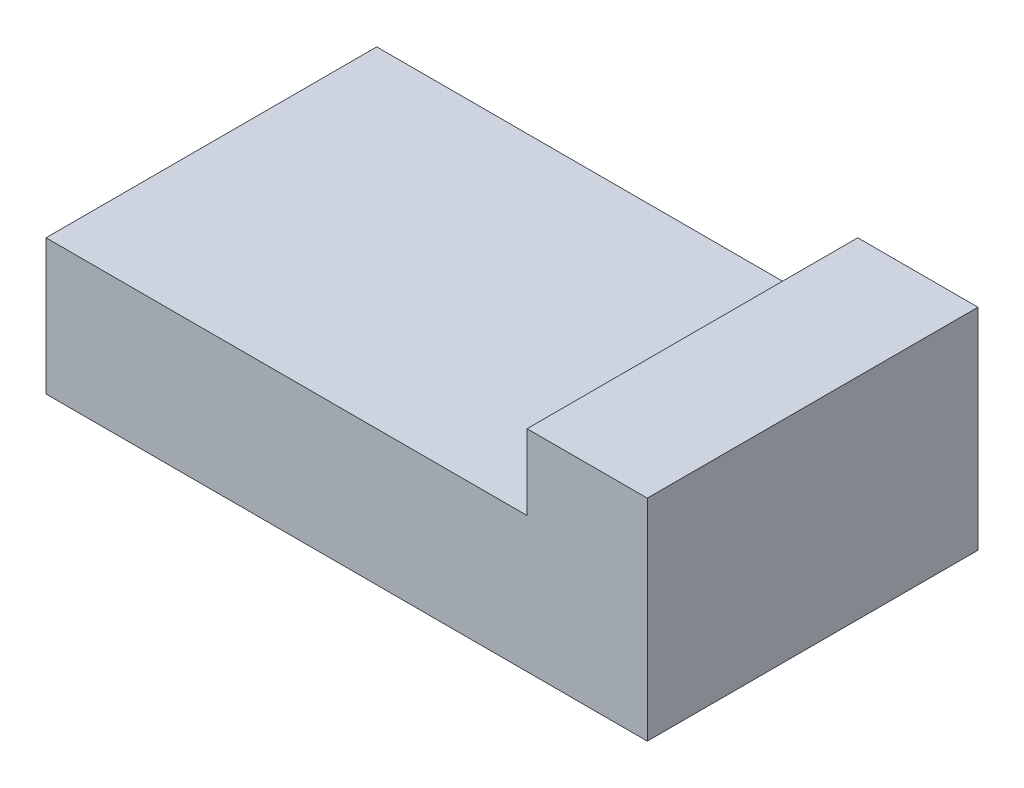
ISO-10303-21;
HEADER;
FILE_DESCRIPTION(('STEP AP214'),'2;1');
FILE_NAME('part.step','',(''),(''),'','','');
FILE_SCHEMA(('AUTOMOTIVE_DESIGN { 1 0 10303 214 1 1 1 1 }'));
ENDSEC;
DATA;
#1=APPLICATION_CONTEXT('core data for automotive mechanical design processes');
#2=APPLICATION_PROTOCOL_DEFINITION('international standard','automotive_design',2000,#1);
#3=PRODUCT_CONTEXT('',#1,'mechanical');
#4=PRODUCT('Part','Part','',(#3));
#5=PRODUCT_RELATED_PRODUCT_CATEGORY('part','',(#4));
#6=PRODUCT_DEFINITION_FORMATION('','',#4);
#7=PRODUCT_DEFINITION_CONTEXT('part definition',#1,'design');
#8=PRODUCT_DEFINITION('design','',#6,#7);
#9=PRODUCT_DEFINITION_SHAPE('','',#8);
#10=(LENGTH_UNIT() NAMED_UNIT(*) SI_UNIT(.MILLI.,.METRE.));
#11=(NAMED_UNIT(*) PLANE_ANGLE_UNIT() SI_UNIT($,.RADIAN.));
#12=(NAMED_UNIT(*) SI_UNIT($,.STERADIAN.) SOLID_ANGLE_UNIT());
#13=UNCERTAINTY_MEASURE_WITH_UNIT(LENGTH_MEASURE(1.E-05),#10,'distance_accuracy_value','');
#14=(GEOMETRIC_REPRESENTATION_CONTEXT(3) GLOBAL_UNCERTAINTY_ASSIGNED_CONTEXT((#13)) GLOBAL_UNIT_ASSIGNED_CONTEXT((#10,
#11,#12)) REPRESENTATION_CONTEXT('',''));
#15=CARTESIAN_POINT('',(0.,0.,0.));
#16=DIRECTION('',(0.,0.,1.));
#17=DIRECTION('',(1.,0.,0.));
#18=AXIS2_PLACEMENT_3D('',#15,#16,#17);
#19=CARTESIAN_POINT('',(20.,9.,-11.));
#20=DIRECTION('',(-1.,0.,0.));
#21=DIRECTION('',(0.,0.,1.));
#22=AXIS2_PLACEMENT_3D('',#19,#20,#21);
#23=PLANE('',#22);
#24=DIRECTION('',(0.,0.,-1.));
#25=VECTOR('',#24,1.);
#26=CARTESIAN_POINT('',(20.,0.,-11.));
#27=LINE('',#26,#25);
#28=CARTESIAN_POINT('',(20.,0.,11.));
#29=VERTEX_POINT('',#28);
#30=CARTESIAN_POINT('',(20.,0.,-11.));
#31=VERTEX_POINT('',#30);
#32=EDGE_CURVE('E99',#29,#31,#27,.T.);
#33=ORIENTED_EDGE('',*,*,#32,.T.);
#34=DIRECTION('',(0.,-1.,0.));
#35=VECTOR('',#34,1.);
#36=CARTESIAN_POINT('',(20.,9.,-11.));
#37=LINE('',#36,#35);
#38=CARTESIAN_POINT('',(20.,14.,-11.));
#39=VERTEX_POINT('',#38);
#40=EDGE_CURVE('E11',#39,#31,#37,.T.);
#41=ORIENTED_EDGE('',*,*,#40,.F.);
#42=DIRECTION('',(0.,0.,-1.));
#43=VECTOR('',#42,1.);
#44=CARTESIAN_POINT('',(20.,14.,-11.));
#45=LINE('',#44,#43);
#46=CARTESIAN_POINT('',(20.,14.,11.));
#47=VERTEX_POINT('',#46);
#48=EDGE_CURVE('E101',#47,#39,#45,.T.);
#49=ORIENTED_EDGE('',*,*,#48,.F.);
#50=DIRECTION('',(0.,-1.,0.));
#51=VECTOR('',#50,1.);
#52=CARTESIAN_POINT('',(20.,9.,11.));
#53=LINE('',#52,#51);
#54=EDGE_CURVE('E84',#47,#29,#53,.T.);
#55=ORIENTED_EDGE('',*,*,#54,.T.);
#56=EDGE_LOOP('',(#33,#41,#49,#55));
#57=FACE_BOUND('',#56,.T.);
#58=ADVANCED_FACE('F39',(#57),#23,.F.);
#59=CARTESIAN_POINT('',(-20.,9.,-11.));
#60=DIRECTION('',(0.,0.,1.));
#61=DIRECTION('',(1.,0.,0.));
#62=AXIS2_PLACEMENT_3D('',#59,#60,#61);
#63=PLANE('',#62);
#64=DIRECTION('',(-1.,0.,0.));
#65=VECTOR('',#64,1.);
#66=CARTESIAN_POINT('',(-20.,0.,-11.));
#67=LINE('',#66,#65);
#68=CARTESIAN_POINT('',(-20.,0.,-11.));
#69=VERTEX_POINT('',#68);
#70=EDGE_CURVE('E106',#31,#69,#67,.T.);
#71=ORIENTED_EDGE('',*,*,#70,.T.);
#72=DIRECTION('',(0.,-1.,0.));
#73=VECTOR('',#72,1.);
#74=CARTESIAN_POINT('',(-20.,9.,-11.));
#75=LINE('',#74,#73);
#76=CARTESIAN_POINT('',(-20.,9.,-11.));
#77=VERTEX_POINT('',#76);
#78=EDGE_CURVE('E47',#77,#69,#75,.T.);
#79=ORIENTED_EDGE('',*,*,#78,.F.);
#80=DIRECTION('',(-1.,0.,0.));
#81=VECTOR('',#80,1.);
#82=CARTESIAN_POINT('',(-20.,9.,-11.));
#83=LINE('',#82,#81);
#84=CARTESIAN_POINT('',(12.,9.,-11.));
#85=VERTEX_POINT('',#84);
#86=EDGE_CURVE('E92',#85,#77,#83,.T.);
#87=ORIENTED_EDGE('',*,*,#86,.F.);
#88=DIRECTION('',(0.,-1.,0.));
#89=VECTOR('',#88,1.);
#90=CARTESIAN_POINT('',(12.,14.,-11.));
#91=LINE('',#90,#89);
#92=CARTESIAN_POINT('',(12.,14.,-11.));
#93=VERTEX_POINT('',#92);
#94=EDGE_CURVE('E108',#93,#85,#91,.T.);
#95=ORIENTED_EDGE('',*,*,#94,.F.);
#96=DIRECTION('',(-1.,0.,0.));
#97=VECTOR('',#96,1.);
#98=CARTESIAN_POINT('',(20.,14.,-11.));
#99=LINE('',#98,#97);
#100=EDGE_CURVE('E133',#39,#93,#99,.T.);
#101=ORIENTED_EDGE('',*,*,#100,.F.);
#102=ORIENTED_EDGE('',*,*,#40,.T.);
#103=EDGE_LOOP('',(#71,#79,#87,#95,#101,#102));
#104=FACE_BOUND('',#103,.T.);
#105=ADVANCED_FACE('F128',(#104),#63,.F.);
#106=CARTESIAN_POINT('',(-20.,9.,-11.));
#107=DIRECTION('',(1.,0.,0.));
#108=DIRECTION('',(0.,0.,-1.));
#109=AXIS2_PLACEMENT_3D('',#106,#107,#108);
#110=PLANE('',#109);
#111=DIRECTION('',(0.,0.,1.));
#112=VECTOR('',#111,1.);
#113=CARTESIAN_POINT('',(-20.,0.,-11.));
#114=LINE('',#113,#112);
#115=CARTESIAN_POINT('',(-20.,0.,11.));
#116=VERTEX_POINT('',#115);
#117=EDGE_CURVE('E93',#69,#116,#114,.T.);
#118=ORIENTED_EDGE('',*,*,#117,.T.);
#119=DIRECTION('',(0.,-1.,0.));
#120=VECTOR('',#119,1.);
#121=CARTESIAN_POINT('',(-20.,9.,11.));
#122=LINE('',#121,#120);
#123=CARTESIAN_POINT('',(-20.,9.,11.));
#124=VERTEX_POINT('',#123);
#125=EDGE_CURVE('E87',#124,#116,#122,.T.);
#126=ORIENTED_EDGE('',*,*,#125,.F.);
#127=DIRECTION('',(0.,0.,1.));
#128=VECTOR('',#127,1.);
#129=CARTESIAN_POINT('',(-20.,9.,-11.));
#130=LINE('',#129,#128);
#131=EDGE_CURVE('E60',#77,#124,#130,.T.);
#132=ORIENTED_EDGE('',*,*,#131,.F.);
#133=ORIENTED_EDGE('',*,*,#78,.T.);
#134=EDGE_LOOP('',(#118,#126,#132,#133));
#135=FACE_BOUND('',#134,.T.);
#136=ADVANCED_FACE('F126',(#135),#110,.F.);
#137=CARTESIAN_POINT('',(-20.,9.,11.));
#138=DIRECTION('',(0.,0.,-1.));
#139=DIRECTION('',(-1.,0.,0.));
#140=AXIS2_PLACEMENT_3D('',#137,#138,#139);
#141=PLANE('',#140);
#142=DIRECTION('',(1.,0.,0.));
#143=VECTOR('',#142,1.);
#144=CARTESIAN_POINT('',(-20.,0.,11.));
#145=LINE('',#144,#143);
#146=EDGE_CURVE('E80',#116,#29,#145,.T.);
#147=ORIENTED_EDGE('',*,*,#146,.T.);
#148=ORIENTED_EDGE('',*,*,#54,.F.);
#149=DIRECTION('',(1.,0.,0.));
#150=VECTOR('',#149,1.);
#151=CARTESIAN_POINT('',(20.,14.,11.));
#152=LINE('',#151,#150);
#153=CARTESIAN_POINT('',(12.,14.,11.));
#154=VERTEX_POINT('',#153);
#155=EDGE_CURVE('E147',#154,#47,#152,.T.);
#156=ORIENTED_EDGE('',*,*,#155,.F.);
#157=DIRECTION('',(0.,-1.,0.));
#158=VECTOR('',#157,1.);
#159=CARTESIAN_POINT('',(12.,14.,11.));
#160=LINE('',#159,#158);
#161=CARTESIAN_POINT('',(12.,9.,11.));
#162=VERTEX_POINT('',#161);
#163=EDGE_CURVE('E114',#154,#162,#160,.T.);
#164=ORIENTED_EDGE('',*,*,#163,.T.);
#165=DIRECTION('',(1.,0.,0.));
#166=VECTOR('',#165,1.);
#167=CARTESIAN_POINT('',(-20.,9.,11.));
#168=LINE('',#167,#166);
#169=EDGE_CURVE('E103',#124,#162,#168,.T.);
#170=ORIENTED_EDGE('',*,*,#169,.F.);
#171=ORIENTED_EDGE('',*,*,#125,.T.);
#172=EDGE_LOOP('',(#147,#148,#156,#164,#170,#171));
#173=FACE_BOUND('',#172,.T.);
#174=ADVANCED_FACE('F82',(#173),#141,.F.);
#175=CARTESIAN_POINT('',(0.,9.,0.));
#176=DIRECTION('',(0.,1.,0.));
#177=DIRECTION('',(0.,0.,1.));
#178=AXIS2_PLACEMENT_3D('',#175,#176,#177);
#179=PLANE('',#178);
#180=DIRECTION('',(0.,0.,1.));
#181=VECTOR('',#180,1.);
#182=CARTESIAN_POINT('',(12.,9.,-11.));
#183=LINE('',#182,#181);
#184=EDGE_CURVE('E54',#85,#162,#183,.T.);
#185=ORIENTED_EDGE('',*,*,#184,.F.);
#186=ORIENTED_EDGE('',*,*,#86,.T.);
#187=ORIENTED_EDGE('',*,*,#131,.T.);
#188=ORIENTED_EDGE('',*,*,#169,.T.);
#189=EDGE_LOOP('',(#185,#186,#187,#188));
#190=FACE_BOUND('',#189,.T.);
#191=ADVANCED_FACE('F164',(#190),#179,.T.);
#192=CARTESIAN_POINT('',(0.,0.,0.));
#193=DIRECTION('',(0.,1.,0.));
#194=DIRECTION('',(0.,0.,1.));
#195=AXIS2_PLACEMENT_3D('',#192,#193,#194);
#196=PLANE('',#195);
#197=ORIENTED_EDGE('',*,*,#32,.F.);
#198=ORIENTED_EDGE('',*,*,#146,.F.);
#199=ORIENTED_EDGE('',*,*,#117,.F.);
#200=ORIENTED_EDGE('',*,*,#70,.F.);
#201=EDGE_LOOP('',(#197,#198,#199,#200));
#202=FACE_BOUND('',#201,.T.);
#203=ADVANCED_FACE('F105',(#202),#196,.F.);
#204=CARTESIAN_POINT('',(12.,14.,-11.));
#205=DIRECTION('',(1.,0.,0.));
#206=DIRECTION('',(0.,0.,-1.));
#207=AXIS2_PLACEMENT_3D('',#204,#205,#206);
#208=PLANE('',#207);
#209=ORIENTED_EDGE('',*,*,#184,.T.);
#210=ORIENTED_EDGE('',*,*,#163,.F.);
#211=DIRECTION('',(0.,0.,1.));
#212=VECTOR('',#211,1.);
#213=CARTESIAN_POINT('',(12.,14.,-11.));
#214=LINE('',#213,#212);
#215=EDGE_CURVE('E144',#93,#154,#214,.T.);
#216=ORIENTED_EDGE('',*,*,#215,.F.);
#217=ORIENTED_EDGE('',*,*,#94,.T.);
#218=EDGE_LOOP('',(#209,#210,#216,#217));
#219=FACE_BOUND('',#218,.T.);
#220=ADVANCED_FACE('F152',(#219),#208,.F.);
#221=CARTESIAN_POINT('',(0.,14.,0.));
#222=DIRECTION('',(0.,-1.,0.));
#223=DIRECTION('',(0.,0.,-1.));
#224=AXIS2_PLACEMENT_3D('',#221,#222,#223);
#225=PLANE('',#224);
#226=ORIENTED_EDGE('',*,*,#48,.T.);
#227=ORIENTED_EDGE('',*,*,#100,.T.);
#228=ORIENTED_EDGE('',*,*,#215,.T.);
#229=ORIENTED_EDGE('',*,*,#155,.T.);
#230=EDGE_LOOP('',(#226,#227,#228,#229));
#231=FACE_BOUND('',#230,.T.);
#232=ADVANCED_FACE('F146',(#231),#225,.F.);
#233=CLOSED_SHELL('',(#58,#105,#136,#174,#191,#203,#220,#232));
#234=MANIFOLD_SOLID_BREP('B2',#233);
#235=ADVANCED_BREP_SHAPE_REPRESENTATION('',(#18,#234),#14);
#236=SHAPE_DEFINITION_REPRESENTATION(#9,#235);
ENDSEC;
END-ISO-10303-21;
